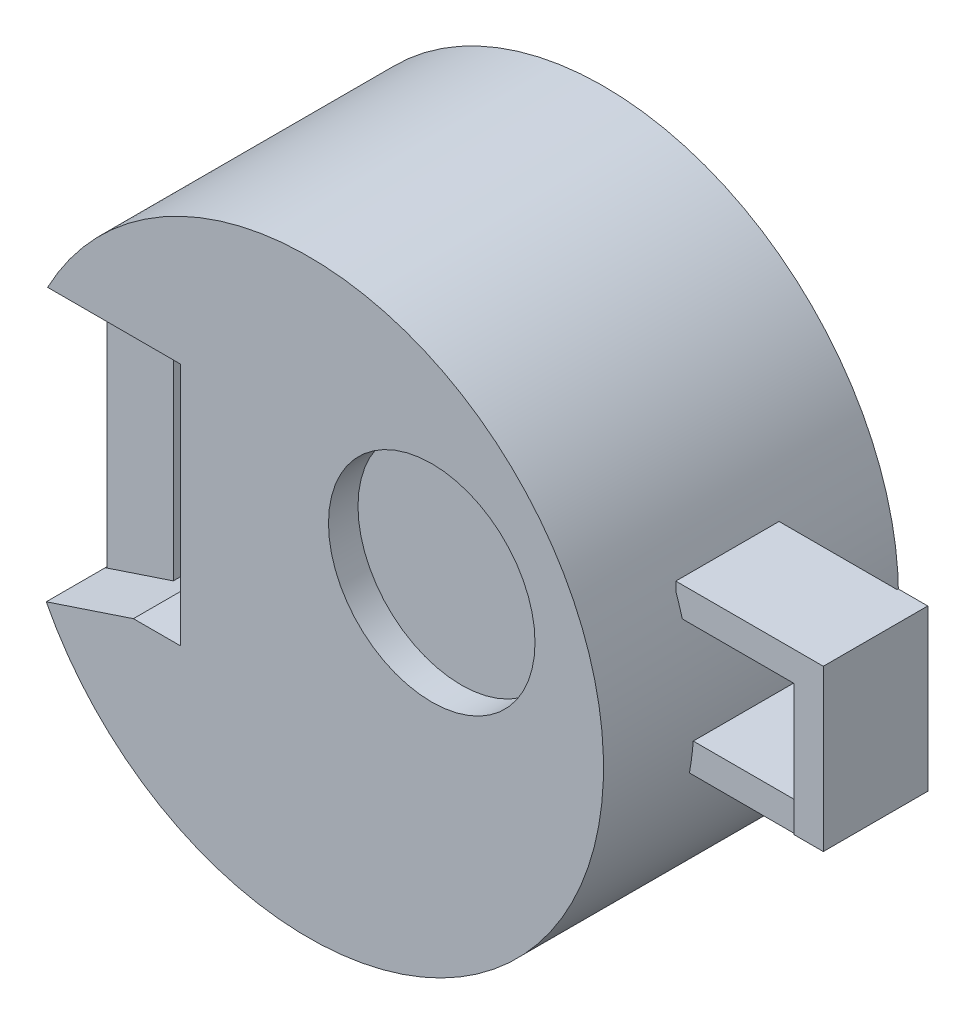
ISO-10303-21;
HEADER;
FILE_DESCRIPTION(('STEP AP214'),'2;1');
FILE_NAME('part.step','',(''),(''),'','','');
FILE_SCHEMA(('AUTOMOTIVE_DESIGN { 1 0 10303 214 1 1 1 1 }'));
ENDSEC;
DATA;
#1=APPLICATION_CONTEXT('core data for automotive mechanical design processes');
#2=APPLICATION_PROTOCOL_DEFINITION('international standard','automotive_design',2000,#1);
#3=PRODUCT_CONTEXT('',#1,'mechanical');
#4=PRODUCT('Part','Part','',(#3));
#5=PRODUCT_RELATED_PRODUCT_CATEGORY('part','',(#4));
#6=PRODUCT_DEFINITION_FORMATION('','',#4);
#7=PRODUCT_DEFINITION_CONTEXT('part definition',#1,'design');
#8=PRODUCT_DEFINITION('design','',#6,#7);
#9=PRODUCT_DEFINITION_SHAPE('','',#8);
#10=(LENGTH_UNIT() NAMED_UNIT(*) SI_UNIT(.MILLI.,.METRE.));
#11=(NAMED_UNIT(*) PLANE_ANGLE_UNIT() SI_UNIT($,.RADIAN.));
#12=(NAMED_UNIT(*) SI_UNIT($,.STERADIAN.) SOLID_ANGLE_UNIT());
#13=UNCERTAINTY_MEASURE_WITH_UNIT(LENGTH_MEASURE(1.E-05),#10,'distance_accuracy_value','');
#14=(GEOMETRIC_REPRESENTATION_CONTEXT(3) GLOBAL_UNCERTAINTY_ASSIGNED_CONTEXT((#13)) GLOBAL_UNIT_ASSIGNED_CONTEXT((#10,
#11,#12)) REPRESENTATION_CONTEXT('',''));
#15=CARTESIAN_POINT('',(0.,0.,0.));
#16=DIRECTION('',(0.,0.,1.));
#17=DIRECTION('',(1.,0.,0.));
#18=AXIS2_PLACEMENT_3D('',#15,#16,#17);
#19=CARTESIAN_POINT('',(0.,0.,10.));
#20=DIRECTION('',(0.,0.,-1.));
#21=DIRECTION('',(-1.,0.,0.));
#22=AXIS2_PLACEMENT_3D('',#19,#20,#21);
#23=CYLINDRICAL_SURFACE('',#22,10.);
#24=CARTESIAN_POINT('',(0.,0.,6.96903270702853));
#25=DIRECTION('',(0.,0.,-1.));
#26=DIRECTION('',(0.,1.,0.));
#27=AXIS2_PLACEMENT_3D('',#24,#25,#26);
#28=CIRCLE('',#27,10.);
#29=CARTESIAN_POINT('',(9.41818365738281,3.361222485318,6.96903270702853));
#30=VERTEX_POINT('',#29);
#31=CARTESIAN_POINT('',(9.63865793998496,2.66388308977043,6.96903270702853));
#32=VERTEX_POINT('',#31);
#33=EDGE_CURVE('E413',#30,#32,#28,.T.);
#34=ORIENTED_EDGE('',*,*,#33,.F.);
#35=DIRECTION('',(0.,0.,-1.));
#36=VECTOR('',#35,1.);
#37=CARTESIAN_POINT('',(9.41818365738281,3.361222485318,10.));
#38=LINE('',#37,#36);
#39=CARTESIAN_POINT('',(9.41818365738281,3.361222485318,3.46903270702853));
#40=VERTEX_POINT('',#39);
#41=EDGE_CURVE('E407',#40,#30,#38,.F.);
#42=ORIENTED_EDGE('',*,*,#41,.F.);
#43=CARTESIAN_POINT('',(0.,0.,3.46903270702853));
#44=DIRECTION('',(0.,0.,-1.));
#45=DIRECTION('',(-1.,0.,0.));
#46=AXIS2_PLACEMENT_3D('',#43,#44,#45);
#47=CIRCLE('',#46,10.);
#48=CARTESIAN_POINT('',(9.63865793998496,2.66388308977043,3.46903270702853));
#49=VERTEX_POINT('',#48);
#50=EDGE_CURVE('E410',#40,#49,#47,.T.);
#51=ORIENTED_EDGE('',*,*,#50,.T.);
#52=DIRECTION('',(0.,0.,-1.));
#53=VECTOR('',#52,1.);
#54=CARTESIAN_POINT('',(9.63865793998496,2.66388308977043,10.));
#55=LINE('',#54,#53);
#56=EDGE_CURVE('E59',#32,#49,#55,.T.);
#57=ORIENTED_EDGE('',*,*,#56,.F.);
#58=EDGE_LOOP('',(#34,#42,#51,#57));
#59=FACE_BOUND('',#58,.T.);
#60=CARTESIAN_POINT('',(0.,0.,0.));
#61=DIRECTION('',(0.,0.,1.));
#62=DIRECTION('',(1.,0.,0.));
#63=AXIS2_PLACEMENT_3D('',#60,#61,#62);
#64=CIRCLE('',#63,10.);
#65=CARTESIAN_POINT('',(-8.86165828998988,-4.63368237489943,0.));
#66=VERTEX_POINT('',#65);
#67=CARTESIAN_POINT('',(-8.84192912040633,4.67121926585667,0.));
#68=VERTEX_POINT('',#67);
#69=EDGE_CURVE('E389',#66,#68,#64,.T.);
#70=ORIENTED_EDGE('',*,*,#69,.T.);
#71=DIRECTION('',(0.,0.,1.));
#72=VECTOR('',#71,1.);
#73=CARTESIAN_POINT('',(-8.84192912040633,4.67121926585667,8.));
#74=LINE('',#73,#72);
#75=CARTESIAN_POINT('',(-8.84192912040633,4.67121926585667,10.));
#76=VERTEX_POINT('',#75);
#77=EDGE_CURVE('E361',#68,#76,#74,.T.);
#78=ORIENTED_EDGE('',*,*,#77,.T.);
#79=CARTESIAN_POINT('',(0.,0.,10.));
#80=DIRECTION('',(0.,0.,1.));
#81=DIRECTION('',(1.,0.,0.));
#82=AXIS2_PLACEMENT_3D('',#79,#80,#81);
#83=CIRCLE('',#82,10.);
#84=CARTESIAN_POINT('',(-8.888807860964,-4.58138568676167,10.));
#85=VERTEX_POINT('',#84);
#86=EDGE_CURVE('E396',#85,#76,#83,.T.);
#87=ORIENTED_EDGE('',*,*,#86,.F.);
#88=DIRECTION('',(0.,0.,1.));
#89=VECTOR('',#88,1.);
#90=CARTESIAN_POINT('',(-8.888807860964,-4.58138568676167,8.));
#91=LINE('',#90,#89);
#92=CARTESIAN_POINT('',(-8.888807860964,-4.58138568676167,8.));
#93=VERTEX_POINT('',#92);
#94=EDGE_CURVE('E359',#93,#85,#91,.T.);
#95=ORIENTED_EDGE('',*,*,#94,.F.);
#96=DIRECTION('',(0.,0.,-1.));
#97=VECTOR('',#96,1.);
#98=CARTESIAN_POINT('',(-8.888807860964,-4.58138568676167,10.));
#99=LINE('',#98,#97);
#100=CARTESIAN_POINT('',(-8.888807860964,-4.58138568676167,2.));
#101=VERTEX_POINT('',#100);
#102=EDGE_CURVE('E309',#93,#101,#99,.T.);
#103=ORIENTED_EDGE('',*,*,#102,.T.);
#104=CARTESIAN_POINT('',(0.,0.,2.));
#105=DIRECTION('',(0.,0.,1.));
#106=DIRECTION('',(1.,0.,0.));
#107=AXIS2_PLACEMENT_3D('',#104,#105,#106);
#108=CIRCLE('',#107,10.);
#109=CARTESIAN_POINT('',(-8.86165828998988,-4.63368237489943,2.));
#110=VERTEX_POINT('',#109);
#111=EDGE_CURVE('E346',#101,#110,#108,.T.);
#112=ORIENTED_EDGE('',*,*,#111,.T.);
#113=DIRECTION('',(0.,0.,-1.));
#114=VECTOR('',#113,1.);
#115=CARTESIAN_POINT('',(-8.86165828998988,-4.63368237489943,2.));
#116=LINE('',#115,#114);
#117=EDGE_CURVE('E343',#110,#66,#116,.T.);
#118=ORIENTED_EDGE('',*,*,#117,.T.);
#119=EDGE_LOOP('',(#70,#78,#87,#95,#103,#112,#118));
#120=FACE_BOUND('',#119,.T.);
#121=CARTESIAN_POINT('',(0.,0.,6.92901878914405));
#122=DIRECTION('',(0.,0.,-1.));
#123=DIRECTION('',(-1.,0.,0.));
#124=AXIS2_PLACEMENT_3D('',#121,#122,#123);
#125=CIRCLE('',#124,10.);
#126=CARTESIAN_POINT('',(9.96985180216051,-0.775922059846825,6.92901878914405));
#127=VERTEX_POINT('',#126);
#128=CARTESIAN_POINT('',(9.8410416540806,-1.77592205984683,6.92901878914405));
#129=VERTEX_POINT('',#128);
#130=EDGE_CURVE('E11',#127,#129,#125,.T.);
#131=ORIENTED_EDGE('',*,*,#130,.F.);
#132=DIRECTION('',(0.,0.,-1.));
#133=VECTOR('',#132,1.);
#134=CARTESIAN_POINT('',(9.96985180216051,-0.775922059846825,10.));
#135=LINE('',#134,#133);
#136=CARTESIAN_POINT('',(9.96985180216051,-0.775922059846825,3.42901878914405));
#137=VERTEX_POINT('',#136);
#138=EDGE_CURVE('E415',#127,#137,#135,.T.);
#139=ORIENTED_EDGE('',*,*,#138,.T.);
#140=CARTESIAN_POINT('',(0.,0.,3.42901878914405));
#141=DIRECTION('',(0.,0.,-1.));
#142=DIRECTION('',(0.,1.,0.));
#143=AXIS2_PLACEMENT_3D('',#140,#141,#142);
#144=CIRCLE('',#143,10.);
#145=CARTESIAN_POINT('',(9.8410416540806,-1.77592205984683,3.42901878914405));
#146=VERTEX_POINT('',#145);
#147=EDGE_CURVE('E418',#137,#146,#144,.T.);
#148=ORIENTED_EDGE('',*,*,#147,.T.);
#149=DIRECTION('',(0.,0.,-1.));
#150=VECTOR('',#149,1.);
#151=CARTESIAN_POINT('',(9.8410416540806,-1.77592205984683,10.));
#152=LINE('',#151,#150);
#153=EDGE_CURVE('E44',#129,#146,#152,.T.);
#154=ORIENTED_EDGE('',*,*,#153,.F.);
#155=EDGE_LOOP('',(#131,#139,#148,#154));
#156=FACE_BOUND('',#155,.T.);
#157=ADVANCED_FACE('F37',(#59,#120,#156),#23,.T.);
#158=CARTESIAN_POINT('',(-2.33883169330325,0.0118497963243738,8.));
#159=DIRECTION('',(0.,0.,1.));
#160=DIRECTION('',(1.,0.,0.));
#161=AXIS2_PLACEMENT_3D('',#158,#159,#160);
#162=PLANE('',#161);
#163=DIRECTION('',(-1.,0.,0.));
#164=VECTOR('',#163,1.);
#165=CARTESIAN_POINT('',(-5.93470943518337,4.67121926585667,8.));
#166=LINE('',#165,#164);
#167=CARTESIAN_POINT('',(-5.93470943518337,4.67121926585667,8.));
#168=VERTEX_POINT('',#167);
#169=CARTESIAN_POINT('',(-8.83452289982483,4.67121926585667,8.));
#170=VERTEX_POINT('',#169);
#171=EDGE_CURVE('E356',#168,#170,#166,.T.);
#172=ORIENTED_EDGE('',*,*,#171,.T.);
#173=DIRECTION('',(0.,1.,0.));
#174=VECTOR('',#173,1.);
#175=CARTESIAN_POINT('',(-8.83452289982483,4.67121926585667,8.));
#176=LINE('',#175,#174);
#177=CARTESIAN_POINT('',(-8.83452289982483,-4.56335129144562,8.));
#178=VERTEX_POINT('',#177);
#179=EDGE_CURVE('E299',#178,#170,#176,.T.);
#180=ORIENTED_EDGE('',*,*,#179,.F.);
#181=DIRECTION('',(0.949000595395018,0.315274277320401,0.));
#182=VECTOR('',#181,1.);
#183=CARTESIAN_POINT('',(-8.888807860964,-4.58138568676167,8.));
#184=LINE('',#183,#182);
#185=CARTESIAN_POINT('',(-6.58181634261719,-3.81496352932526,8.));
#186=VERTEX_POINT('',#185);
#187=EDGE_CURVE('E354',#178,#186,#184,.T.);
#188=ORIENTED_EDGE('',*,*,#187,.T.);
#189=DIRECTION('',(0.,-1.,0.));
#190=VECTOR('',#189,1.);
#191=CARTESIAN_POINT('',(-6.58181634261719,-3.81496352932526,8.));
#192=LINE('',#191,#190);
#193=CARTESIAN_POINT('',(-6.58181634261719,4.61463523566507,8.));
#194=VERTEX_POINT('',#193);
#195=EDGE_CURVE('E316',#194,#186,#192,.T.);
#196=ORIENTED_EDGE('',*,*,#195,.F.);
#197=DIRECTION('',(-1.,0.,0.));
#198=VECTOR('',#197,1.);
#199=CARTESIAN_POINT('',(-6.58181634261719,4.61463523566507,8.));
#200=LINE('',#199,#198);
#201=CARTESIAN_POINT('',(-5.93470943518337,4.61463523566507,8.));
#202=VERTEX_POINT('',#201);
#203=EDGE_CURVE('E313',#202,#194,#200,.T.);
#204=ORIENTED_EDGE('',*,*,#203,.F.);
#205=DIRECTION('',(0.,1.,0.));
#206=VECTOR('',#205,1.);
#207=CARTESIAN_POINT('',(-5.93470943518337,-3.59998351394886,8.));
#208=LINE('',#207,#206);
#209=EDGE_CURVE('E353',#202,#168,#208,.T.);
#210=ORIENTED_EDGE('',*,*,#209,.T.);
#211=EDGE_LOOP('',(#172,#180,#188,#196,#204,#210));
#212=FACE_BOUND('',#211,.T.);
#213=ADVANCED_FACE('F452',(#212),#162,.T.);
#214=CARTESIAN_POINT('',(-5.93470943518337,4.67121926585667,0.));
#215=DIRECTION('',(-1.,0.,0.));
#216=DIRECTION('',(0.,-1.,0.));
#217=AXIS2_PLACEMENT_3D('',#214,#215,#216);
#218=PLANE('',#217);
#219=ORIENTED_EDGE('',*,*,#209,.F.);
#220=DIRECTION('',(0.,0.,1.));
#221=VECTOR('',#220,1.);
#222=CARTESIAN_POINT('',(-5.93470943518337,4.61463523566507,0.));
#223=LINE('',#222,#221);
#224=CARTESIAN_POINT('',(-5.93470943518337,4.61463523566507,2.));
#225=VERTEX_POINT('',#224);
#226=EDGE_CURVE('E320',#225,#202,#223,.T.);
#227=ORIENTED_EDGE('',*,*,#226,.F.);
#228=DIRECTION('',(0.,-1.,0.));
#229=VECTOR('',#228,1.);
#230=CARTESIAN_POINT('',(-5.93470943518337,-4.63368237489942,2.));
#231=LINE('',#230,#229);
#232=CARTESIAN_POINT('',(-5.93470943518337,4.67121926585667,2.));
#233=VERTEX_POINT('',#232);
#234=EDGE_CURVE('E330',#233,#225,#231,.T.);
#235=ORIENTED_EDGE('',*,*,#234,.F.);
#236=DIRECTION('',(0.,0.,1.));
#237=VECTOR('',#236,1.);
#238=CARTESIAN_POINT('',(-5.93470943518337,4.67121926585667,0.));
#239=LINE('',#238,#237);
#240=EDGE_CURVE('E386',#233,#168,#239,.T.);
#241=ORIENTED_EDGE('',*,*,#240,.T.);
#242=EDGE_LOOP('',(#219,#227,#235,#241));
#243=FACE_BOUND('',#242,.T.);
#244=ADVANCED_FACE('F528',(#243),#218,.F.);
#245=CARTESIAN_POINT('',(0.,0.,10.));
#246=DIRECTION('',(0.,0.,1.));
#247=DIRECTION('',(1.,0.,0.));
#248=AXIS2_PLACEMENT_3D('',#245,#246,#247);
#249=PLANE('',#248);
#250=CARTESIAN_POINT('',(4.17755320585655,2.50763600247517,10.));
#251=DIRECTION('',(0.,0.,1.));
#252=DIRECTION('',(1.,0.,0.));
#253=AXIS2_PLACEMENT_3D('',#250,#251,#252);
#254=CIRCLE('',#253,3.5);
#255=CARTESIAN_POINT('',(7.67755320585655,2.50763600247517,10.));
#256=VERTEX_POINT('',#255);
#257=EDGE_CURVE('E281',#256,#256,#254,.T.);
#258=ORIENTED_EDGE('',*,*,#257,.F.);
#259=EDGE_LOOP('',(#258));
#260=FACE_BOUND('',#259,.T.);
#261=ORIENTED_EDGE('',*,*,#86,.T.);
#262=DIRECTION('',(1.,0.,0.));
#263=VECTOR('',#262,1.);
#264=CARTESIAN_POINT('',(-5.93470943518337,4.67121926585667,10.));
#265=LINE('',#264,#263);
#266=CARTESIAN_POINT('',(-4.33452289982483,4.67121926585667,10.));
#267=VERTEX_POINT('',#266);
#268=EDGE_CURVE('E373',#76,#267,#265,.T.);
#269=ORIENTED_EDGE('',*,*,#268,.T.);
#270=DIRECTION('',(0.,-1.,0.));
#271=VECTOR('',#270,1.);
#272=CARTESIAN_POINT('',(-4.33452289982483,4.67121926585667,10.));
#273=LINE('',#272,#271);
#274=CARTESIAN_POINT('',(-4.33452289982483,-3.59998351394886,10.));
#275=VERTEX_POINT('',#274);
#276=EDGE_CURVE('E381',#267,#275,#273,.T.);
#277=ORIENTED_EDGE('',*,*,#276,.T.);
#278=DIRECTION('',(1.,0.,0.));
#279=VECTOR('',#278,1.);
#280=CARTESIAN_POINT('',(-5.93470943518337,-3.59998351394886,10.));
#281=LINE('',#280,#279);
#282=CARTESIAN_POINT('',(-5.93470943518337,-3.59998351394886,10.));
#283=VERTEX_POINT('',#282);
#284=EDGE_CURVE('E364',#283,#275,#281,.T.);
#285=ORIENTED_EDGE('',*,*,#284,.F.);
#286=DIRECTION('',(0.949000595395018,0.315274277320401,0.));
#287=VECTOR('',#286,1.);
#288=CARTESIAN_POINT('',(-8.888807860964,-4.58138568676167,10.));
#289=LINE('',#288,#287);
#290=EDGE_CURVE('E350',#85,#283,#289,.T.);
#291=ORIENTED_EDGE('',*,*,#290,.F.);
#292=EDGE_LOOP('',(#261,#269,#277,#285,#291));
#293=FACE_BOUND('',#292,.T.);
#294=ADVANCED_FACE('F471',(#260,#293),#249,.T.);
#295=CARTESIAN_POINT('',(0.,0.,0.));
#296=DIRECTION('',(0.,0.,1.));
#297=DIRECTION('',(1.,0.,0.));
#298=AXIS2_PLACEMENT_3D('',#295,#296,#297);
#299=PLANE('',#298);
#300=CARTESIAN_POINT('',(3.57662396591312,1.84010387683179,0.));
#301=DIRECTION('',(0.,0.,-1.));
#302=DIRECTION('',(-1.,0.,0.));
#303=AXIS2_PLACEMENT_3D('',#300,#301,#302);
#304=CIRCLE('',#303,3.5);
#305=CARTESIAN_POINT('',(0.0766239659131204,1.84010387683179,0.));
#306=VERTEX_POINT('',#305);
#307=EDGE_CURVE('E285',#306,#306,#304,.T.);
#308=ORIENTED_EDGE('',*,*,#307,.F.);
#309=EDGE_LOOP('',(#308));
#310=FACE_BOUND('',#309,.T.);
#311=DIRECTION('',(1.,0.,0.));
#312=VECTOR('',#311,1.);
#313=CARTESIAN_POINT('',(-5.93470943518337,4.67121926585667,0.));
#314=LINE('',#313,#312);
#315=CARTESIAN_POINT('',(-4.33452289982483,4.67121926585667,0.));
#316=VERTEX_POINT('',#315);
#317=EDGE_CURVE('E376',#68,#316,#314,.T.);
#318=ORIENTED_EDGE('',*,*,#317,.F.);
#319=ORIENTED_EDGE('',*,*,#69,.F.);
#320=DIRECTION('',(-1.,0.,0.));
#321=VECTOR('',#320,1.);
#322=CARTESIAN_POINT('',(-8.86165828998988,-4.63368237489943,0.));
#323=LINE('',#322,#321);
#324=CARTESIAN_POINT('',(-5.93470943518337,-4.63368237489942,0.));
#325=VERTEX_POINT('',#324);
#326=EDGE_CURVE('E341',#325,#66,#323,.T.);
#327=ORIENTED_EDGE('',*,*,#326,.F.);
#328=DIRECTION('',(0.,-1.,0.));
#329=VECTOR('',#328,1.);
#330=CARTESIAN_POINT('',(-5.93470943518337,-4.63368237489942,0.));
#331=LINE('',#330,#329);
#332=CARTESIAN_POINT('',(-5.93470943518337,-3.59998351394886,0.));
#333=VERTEX_POINT('',#332);
#334=EDGE_CURVE('E329',#333,#325,#331,.T.);
#335=ORIENTED_EDGE('',*,*,#334,.F.);
#336=DIRECTION('',(1.,0.,0.));
#337=VECTOR('',#336,1.);
#338=CARTESIAN_POINT('',(-5.93470943518337,-3.59998351394886,0.));
#339=LINE('',#338,#337);
#340=CARTESIAN_POINT('',(-4.33452289982483,-3.59998351394886,0.));
#341=VERTEX_POINT('',#340);
#342=EDGE_CURVE('E369',#333,#341,#339,.T.);
#343=ORIENTED_EDGE('',*,*,#342,.T.);
#344=DIRECTION('',(0.,-1.,0.));
#345=VECTOR('',#344,1.);
#346=CARTESIAN_POINT('',(-4.33452289982483,4.67121926585667,0.));
#347=LINE('',#346,#345);
#348=EDGE_CURVE('E372',#316,#341,#347,.T.);
#349=ORIENTED_EDGE('',*,*,#348,.F.);
#350=EDGE_LOOP('',(#318,#319,#327,#335,#343,#349));
#351=FACE_BOUND('',#350,.T.);
#352=ADVANCED_FACE('F459',(#310,#351),#299,.F.);
#353=CARTESIAN_POINT('',(-5.93470943518337,4.67121926585667,0.));
#354=DIRECTION('',(0.,-1.,0.));
#355=DIRECTION('',(0.,0.,-1.));
#356=AXIS2_PLACEMENT_3D('',#353,#354,#355);
#357=PLANE('',#356);
#358=ORIENTED_EDGE('',*,*,#77,.F.);
#359=ORIENTED_EDGE('',*,*,#317,.T.);
#360=DIRECTION('',(0.,0.,1.));
#361=VECTOR('',#360,1.);
#362=CARTESIAN_POINT('',(-4.33452289982483,4.67121926585667,0.));
#363=LINE('',#362,#361);
#364=EDGE_CURVE('E390',#316,#267,#363,.T.);
#365=ORIENTED_EDGE('',*,*,#364,.T.);
#366=ORIENTED_EDGE('',*,*,#268,.F.);
#367=EDGE_LOOP('',(#358,#359,#365,#366));
#368=FACE_BOUND('',#367,.T.);
#369=DIRECTION('',(0.,0.,-1.));
#370=VECTOR('',#369,1.);
#371=CARTESIAN_POINT('',(-8.83452289982483,4.67121926585667,2.));
#372=LINE('',#371,#370);
#373=CARTESIAN_POINT('',(-8.83452289982483,4.67121926585667,2.));
#374=VERTEX_POINT('',#373);
#375=EDGE_CURVE('E303',#170,#374,#372,.T.);
#376=ORIENTED_EDGE('',*,*,#375,.F.);
#377=ORIENTED_EDGE('',*,*,#171,.F.);
#378=ORIENTED_EDGE('',*,*,#240,.F.);
#379=DIRECTION('',(1.,0.,0.));
#380=VECTOR('',#379,1.);
#381=CARTESIAN_POINT('',(-5.93470943518337,4.67121926585667,2.));
#382=LINE('',#381,#380);
#383=EDGE_CURVE('E337',#374,#233,#382,.T.);
#384=ORIENTED_EDGE('',*,*,#383,.F.);
#385=EDGE_LOOP('',(#376,#377,#378,#384));
#386=FACE_BOUND('',#385,.T.);
#387=ADVANCED_FACE('F464',(#368,#386),#357,.T.);
#388=CARTESIAN_POINT('',(-4.33452289982483,4.67121926585667,0.));
#389=DIRECTION('',(-1.,0.,0.));
#390=DIRECTION('',(0.,-1.,0.));
#391=AXIS2_PLACEMENT_3D('',#388,#389,#390);
#392=PLANE('',#391);
#393=ORIENTED_EDGE('',*,*,#276,.F.);
#394=ORIENTED_EDGE('',*,*,#364,.F.);
#395=ORIENTED_EDGE('',*,*,#348,.T.);
#396=DIRECTION('',(0.,0.,1.));
#397=VECTOR('',#396,1.);
#398=CARTESIAN_POINT('',(-4.33452289982483,-3.59998351394886,0.));
#399=LINE('',#398,#397);
#400=EDGE_CURVE('E392',#341,#275,#399,.T.);
#401=ORIENTED_EDGE('',*,*,#400,.T.);
#402=EDGE_LOOP('',(#393,#394,#395,#401));
#403=FACE_BOUND('',#402,.T.);
#404=ADVANCED_FACE('F468',(#403),#392,.T.);
#405=CARTESIAN_POINT('',(-5.93470943518337,-3.59998351394886,0.));
#406=DIRECTION('',(0.,-1.,0.));
#407=DIRECTION('',(0.,0.,-1.));
#408=AXIS2_PLACEMENT_3D('',#405,#406,#407);
#409=PLANE('',#408);
#410=ORIENTED_EDGE('',*,*,#284,.T.);
#411=ORIENTED_EDGE('',*,*,#400,.F.);
#412=ORIENTED_EDGE('',*,*,#342,.F.);
#413=DIRECTION('',(0.,0.,1.));
#414=VECTOR('',#413,1.);
#415=CARTESIAN_POINT('',(-5.93470943518337,-3.59998351394886,0.));
#416=LINE('',#415,#414);
#417=CARTESIAN_POINT('',(-5.93470943518337,-3.59998351394886,2.));
#418=VERTEX_POINT('',#417);
#419=EDGE_CURVE('E378',#333,#418,#416,.T.);
#420=ORIENTED_EDGE('',*,*,#419,.T.);
#421=DIRECTION('',(0.,0.,1.));
#422=VECTOR('',#421,1.);
#423=CARTESIAN_POINT('',(-5.93470943518337,-3.59998351394886,8.));
#424=LINE('',#423,#422);
#425=EDGE_CURVE('E365',#418,#283,#424,.T.);
#426=ORIENTED_EDGE('',*,*,#425,.T.);
#427=EDGE_LOOP('',(#410,#411,#412,#420,#426));
#428=FACE_BOUND('',#427,.T.);
#429=ADVANCED_FACE('F531',(#428),#409,.F.);
#430=CARTESIAN_POINT('',(-8.888807860964,-4.58138568676167,8.));
#431=DIRECTION('',(0.315274277320401,-0.949000595395018,0.));
#432=DIRECTION('',(0.949000595395018,0.315274277320401,0.));
#433=AXIS2_PLACEMENT_3D('',#430,#431,#432);
#434=PLANE('',#433);
#435=ORIENTED_EDGE('',*,*,#290,.T.);
#436=ORIENTED_EDGE('',*,*,#425,.F.);
#437=DIRECTION('',(0.949000595395018,0.3152742773204,0.));
#438=VECTOR('',#437,1.);
#439=CARTESIAN_POINT('',(-1.62211325566783,-2.16726508313952,2.));
#440=LINE('',#439,#438);
#441=CARTESIAN_POINT('',(-6.58181634261719,-3.81496352932526,2.));
#442=VERTEX_POINT('',#441);
#443=EDGE_CURVE('E322',#442,#418,#440,.T.);
#444=ORIENTED_EDGE('',*,*,#443,.F.);
#445=DIRECTION('',(0.,0.,1.));
#446=VECTOR('',#445,1.);
#447=CARTESIAN_POINT('',(-6.58181634261719,-3.81496352932526,0.));
#448=LINE('',#447,#446);
#449=EDGE_CURVE('E323',#442,#186,#448,.T.);
#450=ORIENTED_EDGE('',*,*,#449,.T.);
#451=ORIENTED_EDGE('',*,*,#187,.F.);
#452=EDGE_CURVE('E351',#93,#178,#184,.T.);
#453=ORIENTED_EDGE('',*,*,#452,.F.);
#454=ORIENTED_EDGE('',*,*,#94,.T.);
#455=EDGE_LOOP('',(#435,#436,#444,#450,#451,#453,#454));
#456=FACE_BOUND('',#455,.T.);
#457=ADVANCED_FACE('F477',(#456),#434,.F.);
#458=CARTESIAN_POINT('',(-2.34376684272772,0.00496948547010467,2.));
#459=DIRECTION('',(0.,0.,1.));
#460=DIRECTION('',(1.,0.,0.));
#461=AXIS2_PLACEMENT_3D('',#458,#459,#460);
#462=PLANE('',#461);
#463=ORIENTED_EDGE('',*,*,#111,.F.);
#464=DIRECTION('',(-1.,0.,0.));
#465=VECTOR('',#464,1.);
#466=CARTESIAN_POINT('',(-8.83452289982483,-4.58138568676167,2.));
#467=LINE('',#466,#465);
#468=CARTESIAN_POINT('',(-8.83452289982483,-4.58138568676167,2.));
#469=VERTEX_POINT('',#468);
#470=EDGE_CURVE('E305',#469,#101,#467,.T.);
#471=ORIENTED_EDGE('',*,*,#470,.F.);
#472=DIRECTION('',(0.,-1.,0.));
#473=VECTOR('',#472,1.);
#474=CARTESIAN_POINT('',(-8.83452289982483,4.67121926585667,2.));
#475=LINE('',#474,#473);
#476=EDGE_CURVE('E291',#374,#469,#475,.T.);
#477=ORIENTED_EDGE('',*,*,#476,.F.);
#478=ORIENTED_EDGE('',*,*,#383,.T.);
#479=ORIENTED_EDGE('',*,*,#234,.T.);
#480=DIRECTION('',(-1.,0.,0.));
#481=VECTOR('',#480,1.);
#482=CARTESIAN_POINT('',(-2.34376684272772,4.61463523566507,2.));
#483=LINE('',#482,#481);
#484=CARTESIAN_POINT('',(-6.58181634261719,4.61463523566507,2.));
#485=VERTEX_POINT('',#484);
#486=EDGE_CURVE('E404',#225,#485,#483,.T.);
#487=ORIENTED_EDGE('',*,*,#486,.T.);
#488=DIRECTION('',(0.,-1.,0.));
#489=VECTOR('',#488,1.);
#490=CARTESIAN_POINT('',(-6.58181634261719,0.00496948547010467,2.));
#491=LINE('',#490,#489);
#492=EDGE_CURVE('E399',#485,#442,#491,.T.);
#493=ORIENTED_EDGE('',*,*,#492,.T.);
#494=ORIENTED_EDGE('',*,*,#443,.T.);
#495=CARTESIAN_POINT('',(-5.93470943518337,-4.63368237489942,2.));
#496=VERTEX_POINT('',#495);
#497=EDGE_CURVE('E334',#418,#496,#231,.T.);
#498=ORIENTED_EDGE('',*,*,#497,.T.);
#499=DIRECTION('',(-1.,0.,0.));
#500=VECTOR('',#499,1.);
#501=CARTESIAN_POINT('',(-8.86165828998988,-4.63368237489943,2.));
#502=LINE('',#501,#500);
#503=EDGE_CURVE('E333',#496,#110,#502,.T.);
#504=ORIENTED_EDGE('',*,*,#503,.T.);
#505=EDGE_LOOP('',(#463,#471,#477,#478,#479,#487,#493,#494,#498,#504));
#506=FACE_BOUND('',#505,.T.);
#507=ADVANCED_FACE('F496',(#506),#462,.F.);
#508=CARTESIAN_POINT('',(-5.93470943518337,-4.63368237489942,2.));
#509=DIRECTION('',(1.,0.,0.));
#510=DIRECTION('',(0.,0.,-1.));
#511=AXIS2_PLACEMENT_3D('',#508,#509,#510);
#512=PLANE('',#511);
#513=ORIENTED_EDGE('',*,*,#334,.T.);
#514=DIRECTION('',(0.,0.,-1.));
#515=VECTOR('',#514,1.);
#516=CARTESIAN_POINT('',(-5.93470943518337,-4.63368237489942,2.));
#517=LINE('',#516,#515);
#518=EDGE_CURVE('E339',#496,#325,#517,.T.);
#519=ORIENTED_EDGE('',*,*,#518,.F.);
#520=ORIENTED_EDGE('',*,*,#497,.F.);
#521=ORIENTED_EDGE('',*,*,#419,.F.);
#522=EDGE_LOOP('',(#513,#519,#520,#521));
#523=FACE_BOUND('',#522,.T.);
#524=ADVANCED_FACE('F519',(#523),#512,.F.);
#525=CARTESIAN_POINT('',(-8.86165828998988,-4.63368237489943,2.));
#526=DIRECTION('',(0.,-1.,0.));
#527=DIRECTION('',(1.,0.,0.));
#528=AXIS2_PLACEMENT_3D('',#525,#526,#527);
#529=PLANE('',#528);
#530=ORIENTED_EDGE('',*,*,#326,.T.);
#531=ORIENTED_EDGE('',*,*,#117,.F.);
#532=ORIENTED_EDGE('',*,*,#503,.F.);
#533=ORIENTED_EDGE('',*,*,#518,.T.);
#534=EDGE_LOOP('',(#530,#531,#532,#533));
#535=FACE_BOUND('',#534,.T.);
#536=ADVANCED_FACE('F515',(#535),#529,.F.);
#537=CARTESIAN_POINT('',(-6.58181634261719,4.61463523566507,0.));
#538=DIRECTION('',(0.,1.,0.));
#539=DIRECTION('',(0.,0.,1.));
#540=AXIS2_PLACEMENT_3D('',#537,#538,#539);
#541=PLANE('',#540);
#542=ORIENTED_EDGE('',*,*,#226,.T.);
#543=ORIENTED_EDGE('',*,*,#203,.T.);
#544=DIRECTION('',(0.,0.,1.));
#545=VECTOR('',#544,1.);
#546=CARTESIAN_POINT('',(-6.58181634261719,4.61463523566507,0.));
#547=LINE('',#546,#545);
#548=EDGE_CURVE('E319',#485,#194,#547,.T.);
#549=ORIENTED_EDGE('',*,*,#548,.F.);
#550=ORIENTED_EDGE('',*,*,#486,.F.);
#551=EDGE_LOOP('',(#542,#543,#549,#550));
#552=FACE_BOUND('',#551,.T.);
#553=ADVANCED_FACE('F508',(#552),#541,.F.);
#554=CARTESIAN_POINT('',(-6.58181634261719,-3.81496352932526,0.));
#555=DIRECTION('',(-1.,0.,0.));
#556=DIRECTION('',(0.,0.,1.));
#557=AXIS2_PLACEMENT_3D('',#554,#555,#556);
#558=PLANE('',#557);
#559=ORIENTED_EDGE('',*,*,#548,.T.);
#560=ORIENTED_EDGE('',*,*,#195,.T.);
#561=ORIENTED_EDGE('',*,*,#449,.F.);
#562=ORIENTED_EDGE('',*,*,#492,.F.);
#563=EDGE_LOOP('',(#559,#560,#561,#562));
#564=FACE_BOUND('',#563,.T.);
#565=ADVANCED_FACE('F501',(#564),#558,.F.);
#566=CARTESIAN_POINT('',(-8.83452289982483,-4.58138568676167,2.));
#567=DIRECTION('',(0.,-1.,0.));
#568=DIRECTION('',(0.,0.,-1.));
#569=AXIS2_PLACEMENT_3D('',#566,#567,#568);
#570=PLANE('',#569);
#571=DIRECTION('',(-1.,0.,0.));
#572=VECTOR('',#571,1.);
#573=CARTESIAN_POINT('',(-8.83452289982483,-4.58138568676167,8.));
#574=LINE('',#573,#572);
#575=CARTESIAN_POINT('',(-8.83452289982483,-4.58138568676167,8.));
#576=VERTEX_POINT('',#575);
#577=EDGE_CURVE('E306',#576,#93,#574,.T.);
#578=ORIENTED_EDGE('',*,*,#577,.F.);
#579=DIRECTION('',(0.,0.,1.));
#580=VECTOR('',#579,1.);
#581=CARTESIAN_POINT('',(-8.83452289982483,-4.58138568676167,2.));
#582=LINE('',#581,#580);
#583=EDGE_CURVE('E296',#469,#576,#582,.T.);
#584=ORIENTED_EDGE('',*,*,#583,.F.);
#585=ORIENTED_EDGE('',*,*,#470,.T.);
#586=ORIENTED_EDGE('',*,*,#102,.F.);
#587=EDGE_LOOP('',(#578,#584,#585,#586));
#588=FACE_BOUND('',#587,.T.);
#589=ADVANCED_FACE('F499',(#588),#570,.F.);
#590=CARTESIAN_POINT('',(-8.83452289982483,4.67121926585667,8.));
#591=DIRECTION('',(0.,0.,1.));
#592=DIRECTION('',(1.,0.,0.));
#593=AXIS2_PLACEMENT_3D('',#590,#591,#592);
#594=PLANE('',#593);
#595=EDGE_CURVE('E300',#576,#178,#176,.T.);
#596=ORIENTED_EDGE('',*,*,#595,.F.);
#597=ORIENTED_EDGE('',*,*,#577,.T.);
#598=ORIENTED_EDGE('',*,*,#452,.T.);
#599=EDGE_LOOP('',(#596,#597,#598));
#600=FACE_BOUND('',#599,.T.);
#601=ADVANCED_FACE('F481',(#600),#594,.F.);
#602=CARTESIAN_POINT('',(-8.83452289982483,0.,0.));
#603=DIRECTION('',(-1.,0.,0.));
#604=DIRECTION('',(0.,0.,1.));
#605=AXIS2_PLACEMENT_3D('',#602,#603,#604);
#606=PLANE('',#605);
#607=ORIENTED_EDGE('',*,*,#476,.T.);
#608=ORIENTED_EDGE('',*,*,#583,.T.);
#609=ORIENTED_EDGE('',*,*,#595,.T.);
#610=ORIENTED_EDGE('',*,*,#179,.T.);
#611=ORIENTED_EDGE('',*,*,#375,.T.);
#612=EDGE_LOOP('',(#607,#608,#609,#610,#611));
#613=FACE_BOUND('',#612,.T.);
#614=ADVANCED_FACE('F484',(#613),#606,.T.);
#615=CARTESIAN_POINT('',(3.57662396591312,1.84010387683179,1.));
#616=DIRECTION('',(0.,0.,-1.));
#617=DIRECTION('',(-1.,0.,0.));
#618=AXIS2_PLACEMENT_3D('',#615,#616,#617);
#619=CYLINDRICAL_SURFACE('',#618,3.5);
#620=CARTESIAN_POINT('',(3.57662396591312,1.84010387683179,1.));
#621=DIRECTION('',(0.,0.,-1.));
#622=DIRECTION('',(-1.,0.,0.));
#623=AXIS2_PLACEMENT_3D('',#620,#621,#622);
#624=CIRCLE('',#623,3.5);
#625=CARTESIAN_POINT('',(0.0766239659131204,1.84010387683179,1.));
#626=VERTEX_POINT('',#625);
#627=EDGE_CURVE('E288',#626,#626,#624,.T.);
#628=ORIENTED_EDGE('',*,*,#627,.F.);
#629=EDGE_LOOP('',(#628));
#630=FACE_BOUND('',#629,.T.);
#631=ORIENTED_EDGE('',*,*,#307,.T.);
#632=EDGE_LOOP('',(#631));
#633=FACE_BOUND('',#632,.T.);
#634=ADVANCED_FACE('F550',(#630,#633),#619,.F.);
#635=CARTESIAN_POINT('',(3.57662396591312,1.84010387683179,1.));
#636=DIRECTION('',(0.,0.,-1.));
#637=DIRECTION('',(-1.,0.,0.));
#638=AXIS2_PLACEMENT_3D('',#635,#636,#637);
#639=PLANE('',#638);
#640=ORIENTED_EDGE('',*,*,#627,.T.);
#641=EDGE_LOOP('',(#640));
#642=FACE_BOUND('',#641,.T.);
#643=ADVANCED_FACE('F552',(#642),#639,.T.);
#644=CARTESIAN_POINT('',(4.17755320585655,2.50763600247517,9.));
#645=DIRECTION('',(0.,0.,1.));
#646=DIRECTION('',(1.,0.,0.));
#647=AXIS2_PLACEMENT_3D('',#644,#645,#646);
#648=CYLINDRICAL_SURFACE('',#647,3.5);
#649=CARTESIAN_POINT('',(4.17755320585655,2.50763600247517,9.));
#650=DIRECTION('',(0.,0.,1.));
#651=DIRECTION('',(1.,0.,0.));
#652=AXIS2_PLACEMENT_3D('',#649,#650,#651);
#653=CIRCLE('',#652,3.5);
#654=CARTESIAN_POINT('',(7.67755320585655,2.50763600247517,9.));
#655=VERTEX_POINT('',#654);
#656=EDGE_CURVE('E282',#655,#655,#653,.T.);
#657=ORIENTED_EDGE('',*,*,#656,.F.);
#658=EDGE_LOOP('',(#657));
#659=FACE_BOUND('',#658,.T.);
#660=ORIENTED_EDGE('',*,*,#257,.T.);
#661=EDGE_LOOP('',(#660));
#662=FACE_BOUND('',#661,.T.);
#663=ADVANCED_FACE('F559',(#659,#662),#648,.F.);
#664=CARTESIAN_POINT('',(4.17755320585655,2.50763600247517,9.));
#665=DIRECTION('',(0.,0.,1.));
#666=DIRECTION('',(1.,0.,0.));
#667=AXIS2_PLACEMENT_3D('',#664,#665,#666);
#668=PLANE('',#667);
#669=ORIENTED_EDGE('',*,*,#656,.T.);
#670=EDGE_LOOP('',(#669));
#671=FACE_BOUND('',#670,.T.);
#672=ADVANCED_FACE('F566',(#671),#668,.T.);
#673=CARTESIAN_POINT('',(13.4181836573828,2.66388308977043,6.96903270702853));
#674=DIRECTION('',(0.,1.,0.));
#675=DIRECTION('',(0.,0.,1.));
#676=AXIS2_PLACEMENT_3D('',#673,#674,#675);
#677=PLANE('',#676);
#678=DIRECTION('',(-1.,0.,0.));
#679=VECTOR('',#678,1.);
#680=CARTESIAN_POINT('',(13.4181836573828,2.66388308977043,6.96903270702853));
#681=LINE('',#680,#679);
#682=CARTESIAN_POINT('',(13.4181836573828,2.66388308977043,6.96903270702853));
#683=VERTEX_POINT('',#682);
#684=EDGE_CURVE('E278',#683,#32,#681,.T.);
#685=ORIENTED_EDGE('',*,*,#684,.T.);
#686=ORIENTED_EDGE('',*,*,#56,.T.);
#687=DIRECTION('',(-1.,0.,0.));
#688=VECTOR('',#687,1.);
#689=CARTESIAN_POINT('',(13.4181836573828,2.66388308977043,3.46903270702853));
#690=LINE('',#689,#688);
#691=CARTESIAN_POINT('',(13.4181836573828,2.66388308977043,3.46903270702853));
#692=VERTEX_POINT('',#691);
#693=EDGE_CURVE('E275',#692,#49,#690,.T.);
#694=ORIENTED_EDGE('',*,*,#693,.F.);
#695=DIRECTION('',(0.,0.,-1.));
#696=VECTOR('',#695,1.);
#697=CARTESIAN_POINT('',(13.4181836573828,2.66388308977043,6.96903270702853));
#698=LINE('',#697,#696);
#699=EDGE_CURVE('E259',#683,#692,#698,.T.);
#700=ORIENTED_EDGE('',*,*,#699,.F.);
#701=EDGE_LOOP('',(#685,#686,#694,#700));
#702=FACE_BOUND('',#701,.T.);
#703=ADVANCED_FACE('F441',(#702),#677,.F.);
#704=CARTESIAN_POINT('',(9.41818365738281,0.,0.));
#705=DIRECTION('',(1.,0.,0.));
#706=DIRECTION('',(0.,0.,-1.));
#707=AXIS2_PLACEMENT_3D('',#704,#705,#706);
#708=PLANE('',#707);
#709=DIRECTION('',(0.,-1.,0.));
#710=VECTOR('',#709,1.);
#711=CARTESIAN_POINT('',(9.41818365738281,3.66388308977043,3.46903270702853));
#712=LINE('',#711,#710);
#713=CARTESIAN_POINT('',(9.41818365738281,3.66388308977043,3.46903270702853));
#714=VERTEX_POINT('',#713);
#715=EDGE_CURVE('E267',#714,#40,#712,.T.);
#716=ORIENTED_EDGE('',*,*,#715,.T.);
#717=ORIENTED_EDGE('',*,*,#41,.T.);
#718=DIRECTION('',(0.,-1.,0.));
#719=VECTOR('',#718,1.);
#720=CARTESIAN_POINT('',(9.41818365738281,3.66388308977043,6.96903270702853));
#721=LINE('',#720,#719);
#722=CARTESIAN_POINT('',(9.41818365738281,3.66388308977043,6.96903270702853));
#723=VERTEX_POINT('',#722);
#724=EDGE_CURVE('E258',#723,#30,#721,.T.);
#725=ORIENTED_EDGE('',*,*,#724,.F.);
#726=DIRECTION('',(0.,0.,-1.));
#727=VECTOR('',#726,1.);
#728=CARTESIAN_POINT('',(9.41818365738281,3.66388308977043,6.96903270702853));
#729=LINE('',#728,#727);
#730=EDGE_CURVE('E262',#723,#714,#729,.T.);
#731=ORIENTED_EDGE('',*,*,#730,.T.);
#732=EDGE_LOOP('',(#716,#717,#725,#731));
#733=FACE_BOUND('',#732,.T.);
#734=ADVANCED_FACE('F449',(#733),#708,.F.);
#735=CARTESIAN_POINT('',(13.4181836573828,3.66388308977043,6.96903270702853));
#736=DIRECTION('',(0.,0.,-1.));
#737=DIRECTION('',(0.,1.,0.));
#738=AXIS2_PLACEMENT_3D('',#735,#736,#737);
#739=PLANE('',#738);
#740=ORIENTED_EDGE('',*,*,#724,.T.);
#741=ORIENTED_EDGE('',*,*,#33,.T.);
#742=ORIENTED_EDGE('',*,*,#684,.F.);
#743=DIRECTION('',(0.,-1.,0.));
#744=VECTOR('',#743,1.);
#745=CARTESIAN_POINT('',(13.4181836573828,3.66388308977043,6.96903270702853));
#746=LINE('',#745,#744);
#747=CARTESIAN_POINT('',(13.4181836573828,-1.77592205984683,6.96903270702853));
#748=VERTEX_POINT('',#747);
#749=EDGE_CURVE('E231',#683,#748,#746,.T.);
#750=ORIENTED_EDGE('',*,*,#749,.T.);
#751=DIRECTION('',(-1.,0.,0.));
#752=VECTOR('',#751,1.);
#753=CARTESIAN_POINT('',(14.4181836573828,-1.77592205984683,6.96903270702853));
#754=LINE('',#753,#752);
#755=CARTESIAN_POINT('',(14.4181836573828,-1.77592205984683,6.96903270702853));
#756=VERTEX_POINT('',#755);
#757=EDGE_CURVE('E216',#756,#748,#754,.T.);
#758=ORIENTED_EDGE('',*,*,#757,.F.);
#759=DIRECTION('',(0.,-1.,0.));
#760=VECTOR('',#759,1.);
#761=CARTESIAN_POINT('',(14.4181836573828,3.66388308977043,6.96903270702853));
#762=LINE('',#761,#760);
#763=CARTESIAN_POINT('',(14.4181836573828,3.66388308977043,6.96903270702853));
#764=VERTEX_POINT('',#763);
#765=EDGE_CURVE('E217',#764,#756,#762,.T.);
#766=ORIENTED_EDGE('',*,*,#765,.F.);
#767=DIRECTION('',(-1.,0.,0.));
#768=VECTOR('',#767,1.);
#769=CARTESIAN_POINT('',(13.4181836573828,3.66388308977043,6.96903270702853));
#770=LINE('',#769,#768);
#771=EDGE_CURVE('E229',#764,#723,#770,.T.);
#772=ORIENTED_EDGE('',*,*,#771,.T.);
#773=EDGE_LOOP('',(#740,#741,#742,#750,#758,#766,#772));
#774=FACE_BOUND('',#773,.T.);
#775=ADVANCED_FACE('F436',(#774),#739,.F.);
#776=CARTESIAN_POINT('',(13.4181836573828,3.66388308977043,3.46903270702853));
#777=DIRECTION('',(0.,0.,-1.));
#778=DIRECTION('',(-1.,0.,0.));
#779=AXIS2_PLACEMENT_3D('',#776,#777,#778);
#780=PLANE('',#779);
#781=ORIENTED_EDGE('',*,*,#50,.F.);
#782=ORIENTED_EDGE('',*,*,#715,.F.);
#783=DIRECTION('',(-1.,0.,0.));
#784=VECTOR('',#783,1.);
#785=CARTESIAN_POINT('',(13.4181836573828,3.66388308977043,3.46903270702853));
#786=LINE('',#785,#784);
#787=CARTESIAN_POINT('',(13.4181836573828,3.66388308977043,3.46903270702853));
#788=VERTEX_POINT('',#787);
#789=EDGE_CURVE('E273',#788,#714,#786,.T.);
#790=ORIENTED_EDGE('',*,*,#789,.F.);
#791=DIRECTION('',(0.,-1.,0.));
#792=VECTOR('',#791,1.);
#793=CARTESIAN_POINT('',(13.4181836573828,3.66388308977043,3.46903270702853));
#794=LINE('',#793,#792);
#795=EDGE_CURVE('E261',#788,#692,#794,.T.);
#796=ORIENTED_EDGE('',*,*,#795,.T.);
#797=ORIENTED_EDGE('',*,*,#693,.T.);
#798=EDGE_LOOP('',(#781,#782,#790,#796,#797));
#799=FACE_BOUND('',#798,.T.);
#800=ADVANCED_FACE('F445',(#799),#780,.T.);
#801=CARTESIAN_POINT('',(13.4181836573828,3.66388308977043,6.96903270702853));
#802=DIRECTION('',(0.,1.,0.));
#803=DIRECTION('',(0.,0.,1.));
#804=AXIS2_PLACEMENT_3D('',#801,#802,#803);
#805=PLANE('',#804);
#806=ORIENTED_EDGE('',*,*,#730,.F.);
#807=ORIENTED_EDGE('',*,*,#771,.F.);
#808=DIRECTION('',(0.,0.,-1.));
#809=VECTOR('',#808,1.);
#810=CARTESIAN_POINT('',(14.4181836573828,3.66388308977043,6.96903270702853));
#811=LINE('',#810,#809);
#812=CARTESIAN_POINT('',(14.4181836573828,3.66388308977043,3.42901878914405));
#813=VERTEX_POINT('',#812);
#814=EDGE_CURVE('E223',#764,#813,#811,.T.);
#815=ORIENTED_EDGE('',*,*,#814,.T.);
#816=DIRECTION('',(-1.,0.,0.));
#817=VECTOR('',#816,1.);
#818=CARTESIAN_POINT('',(14.4181836573828,3.66388308977043,3.42901878914405));
#819=LINE('',#818,#817);
#820=CARTESIAN_POINT('',(13.4181836573828,3.66388308977043,3.42901878914405));
#821=VERTEX_POINT('',#820);
#822=EDGE_CURVE('E207',#813,#821,#819,.T.);
#823=ORIENTED_EDGE('',*,*,#822,.T.);
#824=DIRECTION('',(0.,0.,-1.));
#825=VECTOR('',#824,1.);
#826=CARTESIAN_POINT('',(13.4181836573828,3.66388308977043,6.96903270702853));
#827=LINE('',#826,#825);
#828=EDGE_CURVE('E238',#788,#821,#827,.T.);
#829=ORIENTED_EDGE('',*,*,#828,.F.);
#830=ORIENTED_EDGE('',*,*,#789,.T.);
#831=EDGE_LOOP('',(#806,#807,#815,#823,#829,#830));
#832=FACE_BOUND('',#831,.T.);
#833=ADVANCED_FACE('F228',(#832),#805,.T.);
#834=CARTESIAN_POINT('',(13.4181836573828,-1.77592205984683,6.92901878914405));
#835=DIRECTION('',(0.,1.,0.));
#836=DIRECTION('',(0.,0.,1.));
#837=AXIS2_PLACEMENT_3D('',#834,#835,#836);
#838=PLANE('',#837);
#839=DIRECTION('',(-1.,0.,0.));
#840=VECTOR('',#839,1.);
#841=CARTESIAN_POINT('',(13.4181836573828,-1.77592205984683,6.92901878914405));
#842=LINE('',#841,#840);
#843=CARTESIAN_POINT('',(13.4181836573828,-1.77592205984683,6.92901878914405));
#844=VERTEX_POINT('',#843);
#845=EDGE_CURVE('E255',#844,#129,#842,.T.);
#846=ORIENTED_EDGE('',*,*,#845,.T.);
#847=ORIENTED_EDGE('',*,*,#153,.T.);
#848=DIRECTION('',(-1.,0.,0.));
#849=VECTOR('',#848,1.);
#850=CARTESIAN_POINT('',(13.4181836573828,-1.77592205984683,3.42901878914405));
#851=LINE('',#850,#849);
#852=CARTESIAN_POINT('',(14.4181836573828,-1.77592205984683,3.42901878914405));
#853=VERTEX_POINT('',#852);
#854=EDGE_CURVE('E253',#853,#146,#851,.T.);
#855=ORIENTED_EDGE('',*,*,#854,.F.);
#856=DIRECTION('',(0.,0.,-1.));
#857=VECTOR('',#856,1.);
#858=CARTESIAN_POINT('',(14.4181836573828,-1.77592205984683,6.96903270702853));
#859=LINE('',#858,#857);
#860=EDGE_CURVE('E225',#756,#853,#859,.T.);
#861=ORIENTED_EDGE('',*,*,#860,.F.);
#862=ORIENTED_EDGE('',*,*,#757,.T.);
#863=DIRECTION('',(0.,0.,-1.));
#864=VECTOR('',#863,1.);
#865=CARTESIAN_POINT('',(13.4181836573828,-1.77592205984683,6.96903270702853));
#866=LINE('',#865,#864);
#867=EDGE_CURVE('E233',#748,#844,#866,.T.);
#868=ORIENTED_EDGE('',*,*,#867,.T.);
#869=EDGE_LOOP('',(#846,#847,#855,#861,#862,#868));
#870=FACE_BOUND('',#869,.T.);
#871=ADVANCED_FACE('F422',(#870),#838,.F.);
#872=CARTESIAN_POINT('',(13.4181836573828,-0.775922059846825,6.92901878914405));
#873=DIRECTION('',(0.,1.,0.));
#874=DIRECTION('',(0.,0.,1.));
#875=AXIS2_PLACEMENT_3D('',#872,#873,#874);
#876=PLANE('',#875);
#877=ORIENTED_EDGE('',*,*,#138,.F.);
#878=DIRECTION('',(-1.,0.,0.));
#879=VECTOR('',#878,1.);
#880=CARTESIAN_POINT('',(13.4181836573828,-0.775922059846825,6.92901878914405));
#881=LINE('',#880,#879);
#882=CARTESIAN_POINT('',(13.4181836573828,-0.775922059846825,6.92901878914405));
#883=VERTEX_POINT('',#882);
#884=EDGE_CURVE('E249',#883,#127,#881,.T.);
#885=ORIENTED_EDGE('',*,*,#884,.F.);
#886=DIRECTION('',(0.,0.,-1.));
#887=VECTOR('',#886,1.);
#888=CARTESIAN_POINT('',(13.4181836573828,-0.775922059846825,6.92901878914405));
#889=LINE('',#888,#887);
#890=CARTESIAN_POINT('',(13.4181836573828,-0.775922059846825,3.42901878914405));
#891=VERTEX_POINT('',#890);
#892=EDGE_CURVE('E247',#883,#891,#889,.T.);
#893=ORIENTED_EDGE('',*,*,#892,.T.);
#894=DIRECTION('',(-1.,0.,0.));
#895=VECTOR('',#894,1.);
#896=CARTESIAN_POINT('',(13.4181836573828,-0.775922059846825,3.42901878914405));
#897=LINE('',#896,#895);
#898=EDGE_CURVE('E51',#891,#137,#897,.T.);
#899=ORIENTED_EDGE('',*,*,#898,.T.);
#900=EDGE_LOOP('',(#877,#885,#893,#899));
#901=FACE_BOUND('',#900,.T.);
#902=ADVANCED_FACE('F427',(#901),#876,.T.);
#903=CARTESIAN_POINT('',(13.4181836573828,-0.775922059846825,6.92901878914405));
#904=DIRECTION('',(0.,0.,-1.));
#905=DIRECTION('',(-1.,0.,0.));
#906=AXIS2_PLACEMENT_3D('',#903,#904,#905);
#907=PLANE('',#906);
#908=ORIENTED_EDGE('',*,*,#884,.T.);
#909=ORIENTED_EDGE('',*,*,#130,.T.);
#910=ORIENTED_EDGE('',*,*,#845,.F.);
#911=DIRECTION('',(0.,-1.,0.));
#912=VECTOR('',#911,1.);
#913=CARTESIAN_POINT('',(13.4181836573828,-0.775922059846825,6.92901878914405));
#914=LINE('',#913,#912);
#915=EDGE_CURVE('E244',#883,#844,#914,.T.);
#916=ORIENTED_EDGE('',*,*,#915,.F.);
#917=EDGE_LOOP('',(#908,#909,#910,#916));
#918=FACE_BOUND('',#917,.T.);
#919=ADVANCED_FACE('F430',(#918),#907,.F.);
#920=CARTESIAN_POINT('',(13.4181836573828,-0.775922059846825,3.42901878914405));
#921=DIRECTION('',(0.,0.,-1.));
#922=DIRECTION('',(0.,1.,0.));
#923=AXIS2_PLACEMENT_3D('',#920,#921,#922);
#924=PLANE('',#923);
#925=ORIENTED_EDGE('',*,*,#147,.F.);
#926=ORIENTED_EDGE('',*,*,#898,.F.);
#927=DIRECTION('',(0.,-1.,0.));
#928=VECTOR('',#927,1.);
#929=CARTESIAN_POINT('',(13.4181836573828,3.66388308977043,3.42901878914405));
#930=LINE('',#929,#928);
#931=EDGE_CURVE('E212',#821,#891,#930,.T.);
#932=ORIENTED_EDGE('',*,*,#931,.F.);
#933=ORIENTED_EDGE('',*,*,#822,.F.);
#934=DIRECTION('',(0.,-1.,0.));
#935=VECTOR('',#934,1.);
#936=CARTESIAN_POINT('',(14.4181836573828,3.66388308977043,3.42901878914405));
#937=LINE('',#936,#935);
#938=EDGE_CURVE('E211',#813,#853,#937,.T.);
#939=ORIENTED_EDGE('',*,*,#938,.T.);
#940=ORIENTED_EDGE('',*,*,#854,.T.);
#941=EDGE_LOOP('',(#925,#926,#932,#933,#939,#940));
#942=FACE_BOUND('',#941,.T.);
#943=ADVANCED_FACE('F209',(#942),#924,.T.);
#944=CARTESIAN_POINT('',(14.4181836573828,0.,0.));
#945=DIRECTION('',(-1.,0.,0.));
#946=DIRECTION('',(0.,0.,1.));
#947=AXIS2_PLACEMENT_3D('',#944,#945,#946);
#948=PLANE('',#947);
#949=ORIENTED_EDGE('',*,*,#814,.F.);
#950=ORIENTED_EDGE('',*,*,#765,.T.);
#951=ORIENTED_EDGE('',*,*,#860,.T.);
#952=ORIENTED_EDGE('',*,*,#938,.F.);
#953=EDGE_LOOP('',(#949,#950,#951,#952));
#954=FACE_BOUND('',#953,.T.);
#955=ADVANCED_FACE('F222',(#954),#948,.F.);
#956=CARTESIAN_POINT('',(13.4181836573828,0.,0.));
#957=DIRECTION('',(-1.,0.,0.));
#958=DIRECTION('',(0.,0.,1.));
#959=AXIS2_PLACEMENT_3D('',#956,#957,#958);
#960=PLANE('',#959);
#961=ORIENTED_EDGE('',*,*,#749,.F.);
#962=ORIENTED_EDGE('',*,*,#699,.T.);
#963=ORIENTED_EDGE('',*,*,#795,.F.);
#964=ORIENTED_EDGE('',*,*,#828,.T.);
#965=ORIENTED_EDGE('',*,*,#931,.T.);
#966=ORIENTED_EDGE('',*,*,#892,.F.);
#967=ORIENTED_EDGE('',*,*,#915,.T.);
#968=ORIENTED_EDGE('',*,*,#867,.F.);
#969=EDGE_LOOP('',(#961,#962,#963,#964,#965,#966,#967,#968));
#970=FACE_BOUND('',#969,.T.);
#971=ADVANCED_FACE('F433',(#970),#960,.T.);
#972=CLOSED_SHELL('',(#157,#213,#244,#294,#352,#387,#404,#429,#457,#507,#524,#536,#553,#565,
#589,#601,#614,#634,#643,#663,#672,#703,#734,#775,#800,#833,#871,#902,#919,#943,#955,#971));
#973=MANIFOLD_SOLID_BREP('B2',#972);
#974=ADVANCED_BREP_SHAPE_REPRESENTATION('',(#18,#973),#14);
#975=SHAPE_DEFINITION_REPRESENTATION(#9,#974);
ENDSEC;
END-ISO-10303-21;
